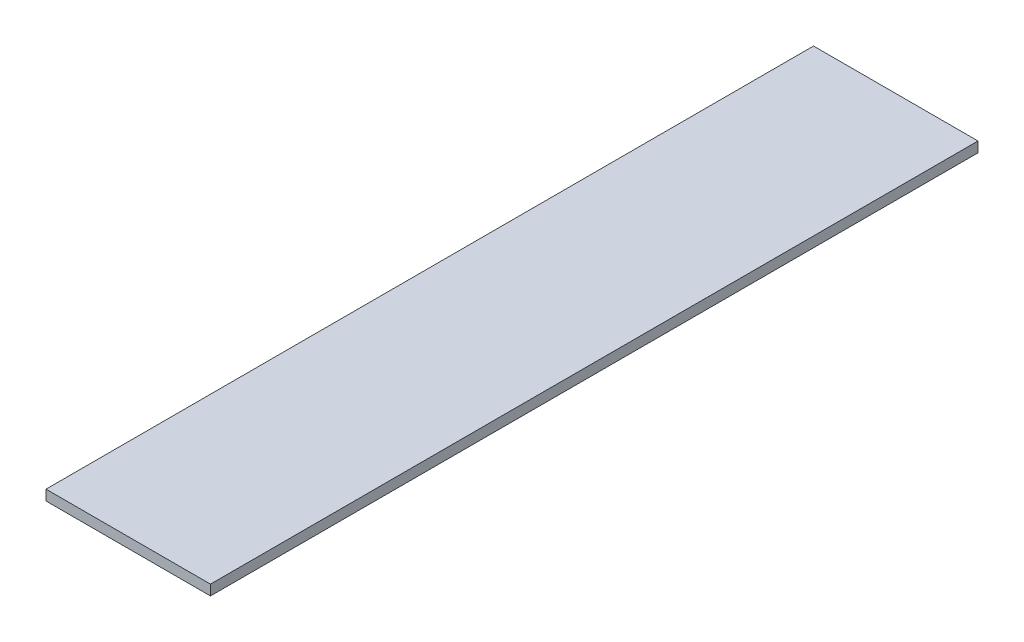
ISO-10303-21;
HEADER;
FILE_DESCRIPTION(('STEP AP214'),'2;1');
FILE_NAME('part.step','',(''),(''),'','','');
FILE_SCHEMA(('AUTOMOTIVE_DESIGN { 1 0 10303 214 1 1 1 1 }'));
ENDSEC;
DATA;
#1=APPLICATION_CONTEXT('core data for automotive mechanical design processes');
#2=APPLICATION_PROTOCOL_DEFINITION('international standard','automotive_design',2000,#1);
#3=PRODUCT_CONTEXT('',#1,'mechanical');
#4=PRODUCT('Part','Part','',(#3));
#5=PRODUCT_RELATED_PRODUCT_CATEGORY('part','',(#4));
#6=PRODUCT_DEFINITION_FORMATION('','',#4);
#7=PRODUCT_DEFINITION_CONTEXT('part definition',#1,'design');
#8=PRODUCT_DEFINITION('design','',#6,#7);
#9=PRODUCT_DEFINITION_SHAPE('','',#8);
#10=(LENGTH_UNIT() NAMED_UNIT(*) SI_UNIT(.MILLI.,.METRE.));
#11=(NAMED_UNIT(*) PLANE_ANGLE_UNIT() SI_UNIT($,.RADIAN.));
#12=(NAMED_UNIT(*) SI_UNIT($,.STERADIAN.) SOLID_ANGLE_UNIT());
#13=UNCERTAINTY_MEASURE_WITH_UNIT(LENGTH_MEASURE(1.E-05),#10,'distance_accuracy_value','');
#14=(GEOMETRIC_REPRESENTATION_CONTEXT(3) GLOBAL_UNCERTAINTY_ASSIGNED_CONTEXT((#13)) GLOBAL_UNIT_ASSIGNED_CONTEXT((#10,
#11,#12)) REPRESENTATION_CONTEXT('',''));
#15=CARTESIAN_POINT('',(0.,0.,0.));
#16=DIRECTION('',(0.,0.,1.));
#17=DIRECTION('',(1.,0.,0.));
#18=AXIS2_PLACEMENT_3D('',#15,#16,#17);
#19=CARTESIAN_POINT('',(76.1999999999999,9.525,-355.6));
#20=DIRECTION('',(-1.,0.,0.));
#21=DIRECTION('',(0.,0.,1.));
#22=AXIS2_PLACEMENT_3D('',#19,#20,#21);
#23=PLANE('',#22);
#24=DIRECTION('',(0.,0.,-1.));
#25=VECTOR('',#24,1.);
#26=CARTESIAN_POINT('',(76.1999999999999,0.,-355.6));
#27=LINE('',#26,#25);
#28=CARTESIAN_POINT('',(76.2,0.,355.6));
#29=VERTEX_POINT('',#28);
#30=CARTESIAN_POINT('',(76.1999999999999,0.,-355.6));
#31=VERTEX_POINT('',#30);
#32=EDGE_CURVE('E95',#29,#31,#27,.T.);
#33=ORIENTED_EDGE('',*,*,#32,.T.);
#34=DIRECTION('',(0.,-1.,0.));
#35=VECTOR('',#34,1.);
#36=CARTESIAN_POINT('',(76.1999999999999,9.525,-355.6));
#37=LINE('',#36,#35);
#38=CARTESIAN_POINT('',(76.1999999999999,9.525,-355.6));
#39=VERTEX_POINT('',#38);
#40=EDGE_CURVE('E11',#39,#31,#37,.T.);
#41=ORIENTED_EDGE('',*,*,#40,.F.);
#42=DIRECTION('',(0.,0.,-1.));
#43=VECTOR('',#42,1.);
#44=CARTESIAN_POINT('',(76.1999999999999,9.525,-355.6));
#45=LINE('',#44,#43);
#46=CARTESIAN_POINT('',(76.2,9.525,355.6));
#47=VERTEX_POINT('',#46);
#48=EDGE_CURVE('E83',#47,#39,#45,.T.);
#49=ORIENTED_EDGE('',*,*,#48,.F.);
#50=DIRECTION('',(0.,-1.,0.));
#51=VECTOR('',#50,1.);
#52=CARTESIAN_POINT('',(76.2,9.525,355.6));
#53=LINE('',#52,#51);
#54=EDGE_CURVE('E91',#47,#29,#53,.T.);
#55=ORIENTED_EDGE('',*,*,#54,.T.);
#56=EDGE_LOOP('',(#33,#41,#49,#55));
#57=FACE_BOUND('',#56,.T.);
#58=ADVANCED_FACE('F32',(#57),#23,.F.);
#59=CARTESIAN_POINT('',(-76.2000000000001,9.525,-355.6));
#60=DIRECTION('',(0.,0.,1.));
#61=DIRECTION('',(1.,0.,0.));
#62=AXIS2_PLACEMENT_3D('',#59,#60,#61);
#63=PLANE('',#62);
#64=DIRECTION('',(-1.,0.,0.));
#65=VECTOR('',#64,1.);
#66=CARTESIAN_POINT('',(-76.2000000000001,0.,-355.6));
#67=LINE('',#66,#65);
#68=CARTESIAN_POINT('',(-76.2000000000001,0.,-355.6));
#69=VERTEX_POINT('',#68);
#70=EDGE_CURVE('E87',#31,#69,#67,.T.);
#71=ORIENTED_EDGE('',*,*,#70,.T.);
#72=DIRECTION('',(0.,-1.,0.));
#73=VECTOR('',#72,1.);
#74=CARTESIAN_POINT('',(-76.2000000000001,9.525,-355.6));
#75=LINE('',#74,#73);
#76=CARTESIAN_POINT('',(-76.2000000000001,9.525,-355.6));
#77=VERTEX_POINT('',#76);
#78=EDGE_CURVE('E40',#77,#69,#75,.T.);
#79=ORIENTED_EDGE('',*,*,#78,.F.);
#80=DIRECTION('',(-1.,0.,0.));
#81=VECTOR('',#80,1.);
#82=CARTESIAN_POINT('',(-76.2000000000001,9.525,-355.6));
#83=LINE('',#82,#81);
#84=EDGE_CURVE('E78',#39,#77,#83,.T.);
#85=ORIENTED_EDGE('',*,*,#84,.F.);
#86=ORIENTED_EDGE('',*,*,#40,.T.);
#87=EDGE_LOOP('',(#71,#79,#85,#86));
#88=FACE_BOUND('',#87,.T.);
#89=ADVANCED_FACE('F86',(#88),#63,.F.);
#90=CARTESIAN_POINT('',(-76.2000000000001,9.525,-355.6));
#91=DIRECTION('',(1.,0.,0.));
#92=DIRECTION('',(0.,0.,-1.));
#93=AXIS2_PLACEMENT_3D('',#90,#91,#92);
#94=PLANE('',#93);
#95=DIRECTION('',(0.,0.,1.));
#96=VECTOR('',#95,1.);
#97=CARTESIAN_POINT('',(-76.2000000000001,0.,-355.6));
#98=LINE('',#97,#96);
#99=CARTESIAN_POINT('',(-76.2,0.,355.6));
#100=VERTEX_POINT('',#99);
#101=EDGE_CURVE('E65',#69,#100,#98,.T.);
#102=ORIENTED_EDGE('',*,*,#101,.T.);
#103=DIRECTION('',(0.,-1.,0.));
#104=VECTOR('',#103,1.);
#105=CARTESIAN_POINT('',(-76.2,9.525,355.6));
#106=LINE('',#105,#104);
#107=CARTESIAN_POINT('',(-76.2,9.525,355.6));
#108=VERTEX_POINT('',#107);
#109=EDGE_CURVE('E88',#108,#100,#106,.T.);
#110=ORIENTED_EDGE('',*,*,#109,.F.);
#111=DIRECTION('',(0.,0.,1.));
#112=VECTOR('',#111,1.);
#113=CARTESIAN_POINT('',(-76.2000000000001,9.525,-355.6));
#114=LINE('',#113,#112);
#115=EDGE_CURVE('E81',#77,#108,#114,.T.);
#116=ORIENTED_EDGE('',*,*,#115,.F.);
#117=ORIENTED_EDGE('',*,*,#78,.T.);
#118=EDGE_LOOP('',(#102,#110,#116,#117));
#119=FACE_BOUND('',#118,.T.);
#120=ADVANCED_FACE('F89',(#119),#94,.F.);
#121=CARTESIAN_POINT('',(-76.2,9.525,355.6));
#122=DIRECTION('',(0.,0.,-1.));
#123=DIRECTION('',(-1.,0.,0.));
#124=AXIS2_PLACEMENT_3D('',#121,#122,#123);
#125=PLANE('',#124);
#126=DIRECTION('',(1.,0.,0.));
#127=VECTOR('',#126,1.);
#128=CARTESIAN_POINT('',(-76.2,0.,355.6));
#129=LINE('',#128,#127);
#130=EDGE_CURVE('E71',#100,#29,#129,.T.);
#131=ORIENTED_EDGE('',*,*,#130,.T.);
#132=ORIENTED_EDGE('',*,*,#54,.F.);
#133=DIRECTION('',(1.,0.,0.));
#134=VECTOR('',#133,1.);
#135=CARTESIAN_POINT('',(-76.2,9.525,355.6));
#136=LINE('',#135,#134);
#137=EDGE_CURVE('E48',#108,#47,#136,.T.);
#138=ORIENTED_EDGE('',*,*,#137,.F.);
#139=ORIENTED_EDGE('',*,*,#109,.T.);
#140=EDGE_LOOP('',(#131,#132,#138,#139));
#141=FACE_BOUND('',#140,.T.);
#142=ADVANCED_FACE('F102',(#141),#125,.F.);
#143=CARTESIAN_POINT('',(0.,9.525,0.));
#144=DIRECTION('',(0.,1.,0.));
#145=DIRECTION('',(0.,0.,1.));
#146=AXIS2_PLACEMENT_3D('',#143,#144,#145);
#147=PLANE('',#146);
#148=ORIENTED_EDGE('',*,*,#48,.T.);
#149=ORIENTED_EDGE('',*,*,#84,.T.);
#150=ORIENTED_EDGE('',*,*,#115,.T.);
#151=ORIENTED_EDGE('',*,*,#137,.T.);
#152=EDGE_LOOP('',(#148,#149,#150,#151));
#153=FACE_BOUND('',#152,.T.);
#154=ADVANCED_FACE('F79',(#153),#147,.T.);
#155=CARTESIAN_POINT('',(0.,0.,0.));
#156=DIRECTION('',(0.,1.,0.));
#157=DIRECTION('',(0.,0.,1.));
#158=AXIS2_PLACEMENT_3D('',#155,#156,#157);
#159=PLANE('',#158);
#160=ORIENTED_EDGE('',*,*,#32,.F.);
#161=ORIENTED_EDGE('',*,*,#130,.F.);
#162=ORIENTED_EDGE('',*,*,#101,.F.);
#163=ORIENTED_EDGE('',*,*,#70,.F.);
#164=EDGE_LOOP('',(#160,#161,#162,#163));
#165=FACE_BOUND('',#164,.T.);
#166=ADVANCED_FACE('F105',(#165),#159,.F.);
#167=CLOSED_SHELL('',(#58,#89,#120,#142,#154,#166));
#168=MANIFOLD_SOLID_BREP('B2',#167);
#169=ADVANCED_BREP_SHAPE_REPRESENTATION('',(#18,#168),#14);
#170=SHAPE_DEFINITION_REPRESENTATION(#9,#169);
ENDSEC;
END-ISO-10303-21;
